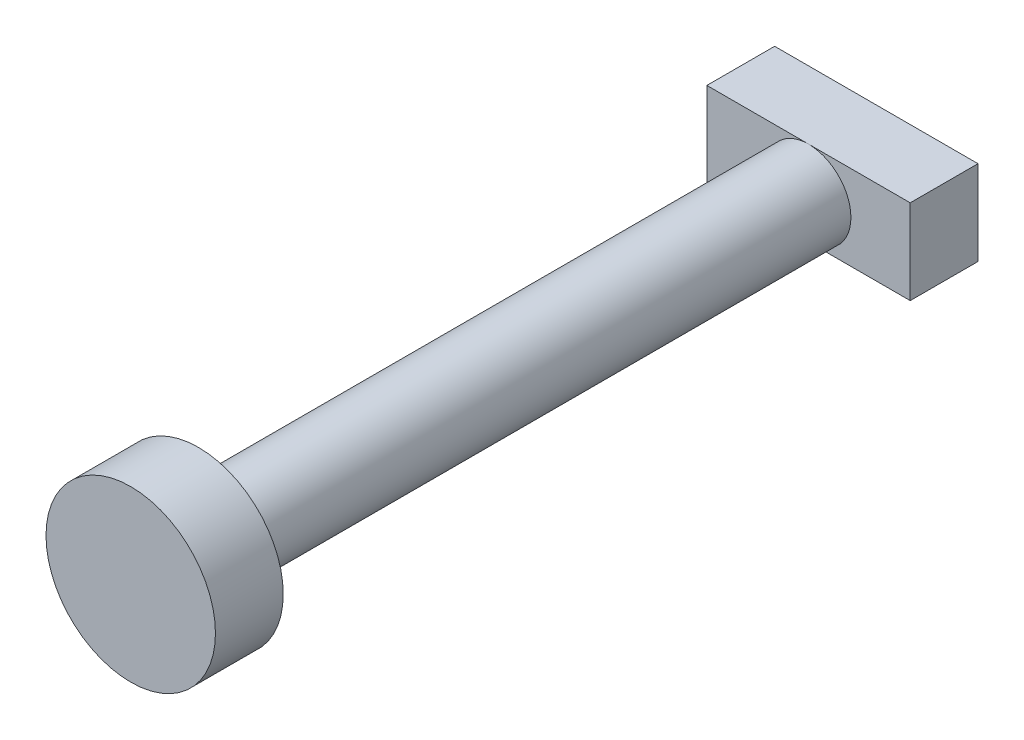
ISO-10303-21;
HEADER;
FILE_DESCRIPTION(('STEP AP214'),'2;1');
FILE_NAME('part.step','',(''),(''),'','','');
FILE_SCHEMA(('AUTOMOTIVE_DESIGN { 1 0 10303 214 1 1 1 1 }'));
ENDSEC;
DATA;
#1=APPLICATION_CONTEXT('core data for automotive mechanical design processes');
#2=APPLICATION_PROTOCOL_DEFINITION('international standard','automotive_design',2000,#1);
#3=PRODUCT_CONTEXT('',#1,'mechanical');
#4=PRODUCT('Part','Part','',(#3));
#5=PRODUCT_RELATED_PRODUCT_CATEGORY('part','',(#4));
#6=PRODUCT_DEFINITION_FORMATION('','',#4);
#7=PRODUCT_DEFINITION_CONTEXT('part definition',#1,'design');
#8=PRODUCT_DEFINITION('design','',#6,#7);
#9=PRODUCT_DEFINITION_SHAPE('','',#8);
#10=(LENGTH_UNIT() NAMED_UNIT(*) SI_UNIT(.MILLI.,.METRE.));
#11=(NAMED_UNIT(*) PLANE_ANGLE_UNIT() SI_UNIT($,.RADIAN.));
#12=(NAMED_UNIT(*) SI_UNIT($,.STERADIAN.) SOLID_ANGLE_UNIT());
#13=UNCERTAINTY_MEASURE_WITH_UNIT(LENGTH_MEASURE(1.E-05),#10,'distance_accuracy_value','');
#14=(GEOMETRIC_REPRESENTATION_CONTEXT(3) GLOBAL_UNCERTAINTY_ASSIGNED_CONTEXT((#13)) GLOBAL_UNIT_ASSIGNED_CONTEXT((#10,
#11,#12)) REPRESENTATION_CONTEXT('',''));
#15=CARTESIAN_POINT('',(0.,0.,0.));
#16=DIRECTION('',(0.,0.,1.));
#17=DIRECTION('',(1.,0.,0.));
#18=AXIS2_PLACEMENT_3D('',#15,#16,#17);
#19=CARTESIAN_POINT('',(0.,0.,9.));
#20=DIRECTION('',(0.,0.,-1.));
#21=DIRECTION('',(-1.,0.,0.));
#22=AXIS2_PLACEMENT_3D('',#19,#20,#21);
#23=CYLINDRICAL_SURFACE('',#22,1.25);
#24=CARTESIAN_POINT('',(0.,0.,9.));
#25=DIRECTION('',(0.,0.,1.));
#26=DIRECTION('',(1.,0.,0.));
#27=AXIS2_PLACEMENT_3D('',#24,#25,#26);
#28=CIRCLE('',#27,1.25);
#29=CARTESIAN_POINT('',(1.25,0.,9.));
#30=VERTEX_POINT('',#29);
#31=EDGE_CURVE('E11',#30,#30,#28,.T.);
#32=ORIENTED_EDGE('',*,*,#31,.F.);
#33=EDGE_LOOP('',(#32));
#34=FACE_BOUND('',#33,.T.);
#35=CARTESIAN_POINT('',(0.,0.,-9.));
#36=DIRECTION('',(0.,0.,1.));
#37=DIRECTION('',(1.,0.,0.));
#38=AXIS2_PLACEMENT_3D('',#35,#36,#37);
#39=CIRCLE('',#38,1.25);
#40=CARTESIAN_POINT('',(0.,1.25,-9.));
#41=VERTEX_POINT('',#40);
#42=CARTESIAN_POINT('',(0.,-1.25,-9.));
#43=VERTEX_POINT('',#42);
#44=EDGE_CURVE('E46',#41,#43,#39,.T.);
#45=ORIENTED_EDGE('',*,*,#44,.T.);
#46=EDGE_CURVE('E65',#43,#41,#39,.T.);
#47=ORIENTED_EDGE('',*,*,#46,.T.);
#48=EDGE_LOOP('',(#45,#47));
#49=FACE_BOUND('',#48,.T.);
#50=ADVANCED_FACE('F43',(#34,#49),#23,.T.);
#51=CARTESIAN_POINT('',(0.,0.,11.));
#52=DIRECTION('',(0.,0.,-1.));
#53=DIRECTION('',(-1.,0.,0.));
#54=AXIS2_PLACEMENT_3D('',#51,#52,#53);
#55=CYLINDRICAL_SURFACE('',#54,2.5);
#56=CARTESIAN_POINT('',(0.,0.,11.));
#57=DIRECTION('',(0.,0.,1.));
#58=DIRECTION('',(1.,0.,0.));
#59=AXIS2_PLACEMENT_3D('',#56,#57,#58);
#60=CIRCLE('',#59,2.5);
#61=CARTESIAN_POINT('',(2.5,0.,11.));
#62=VERTEX_POINT('',#61);
#63=EDGE_CURVE('E122',#62,#62,#60,.T.);
#64=ORIENTED_EDGE('',*,*,#63,.F.);
#65=EDGE_LOOP('',(#64));
#66=FACE_BOUND('',#65,.T.);
#67=CARTESIAN_POINT('',(0.,0.,9.));
#68=DIRECTION('',(0.,0.,1.));
#69=DIRECTION('',(1.,0.,0.));
#70=AXIS2_PLACEMENT_3D('',#67,#68,#69);
#71=CIRCLE('',#70,2.5);
#72=CARTESIAN_POINT('',(2.5,0.,9.));
#73=VERTEX_POINT('',#72);
#74=EDGE_CURVE('E117',#73,#73,#71,.T.);
#75=ORIENTED_EDGE('',*,*,#74,.T.);
#76=EDGE_LOOP('',(#75));
#77=FACE_BOUND('',#76,.T.);
#78=ADVANCED_FACE('F180',(#66,#77),#55,.T.);
#79=CARTESIAN_POINT('',(0.,0.,11.));
#80=DIRECTION('',(0.,0.,1.));
#81=DIRECTION('',(1.,0.,0.));
#82=AXIS2_PLACEMENT_3D('',#79,#80,#81);
#83=PLANE('',#82);
#84=ORIENTED_EDGE('',*,*,#63,.T.);
#85=EDGE_LOOP('',(#84));
#86=FACE_BOUND('',#85,.T.);
#87=ADVANCED_FACE('F187',(#86),#83,.T.);
#88=CARTESIAN_POINT('',(0.,0.,9.));
#89=DIRECTION('',(0.,0.,1.));
#90=DIRECTION('',(1.,0.,0.));
#91=AXIS2_PLACEMENT_3D('',#88,#89,#90);
#92=PLANE('',#91);
#93=ORIENTED_EDGE('',*,*,#31,.T.);
#94=EDGE_LOOP('',(#93));
#95=FACE_BOUND('',#94,.T.);
#96=ORIENTED_EDGE('',*,*,#74,.F.);
#97=EDGE_LOOP('',(#96));
#98=FACE_BOUND('',#97,.T.);
#99=ADVANCED_FACE('F176',(#95,#98),#92,.F.);
#100=CARTESIAN_POINT('',(0.,0.,-9.));
#101=DIRECTION('',(0.,0.,1.));
#102=DIRECTION('',(1.,0.,0.));
#103=AXIS2_PLACEMENT_3D('',#100,#101,#102);
#104=PLANE('',#103);
#105=ORIENTED_EDGE('',*,*,#44,.F.);
#106=DIRECTION('',(1.,0.,0.));
#107=VECTOR('',#106,1.);
#108=CARTESIAN_POINT('',(3.,1.25,-9.));
#109=LINE('',#108,#107);
#110=CARTESIAN_POINT('',(-3.,1.25,-9.));
#111=VERTEX_POINT('',#110);
#112=EDGE_CURVE('E58',#111,#41,#109,.T.);
#113=ORIENTED_EDGE('',*,*,#112,.F.);
#114=DIRECTION('',(0.,1.,0.));
#115=VECTOR('',#114,1.);
#116=CARTESIAN_POINT('',(-3.,-1.25,-9.));
#117=LINE('',#116,#115);
#118=CARTESIAN_POINT('',(-3.,-1.25,-9.));
#119=VERTEX_POINT('',#118);
#120=EDGE_CURVE('E115',#119,#111,#117,.T.);
#121=ORIENTED_EDGE('',*,*,#120,.F.);
#122=DIRECTION('',(-1.,0.,0.));
#123=VECTOR('',#122,1.);
#124=CARTESIAN_POINT('',(3.,-1.25,-9.));
#125=LINE('',#124,#123);
#126=EDGE_CURVE('E139',#43,#119,#125,.T.);
#127=ORIENTED_EDGE('',*,*,#126,.F.);
#128=EDGE_LOOP('',(#105,#113,#121,#127));
#129=FACE_BOUND('',#128,.T.);
#130=ADVANCED_FACE('F138',(#129),#104,.T.);
#131=ORIENTED_EDGE('',*,*,#46,.F.);
#132=CARTESIAN_POINT('',(3.,-1.25,-9.));
#133=VERTEX_POINT('',#132);
#134=EDGE_CURVE('E111',#133,#43,#125,.T.);
#135=ORIENTED_EDGE('',*,*,#134,.F.);
#136=DIRECTION('',(0.,-1.,0.));
#137=VECTOR('',#136,1.);
#138=CARTESIAN_POINT('',(3.,-1.25,-9.));
#139=LINE('',#138,#137);
#140=CARTESIAN_POINT('',(3.,1.25,-9.));
#141=VERTEX_POINT('',#140);
#142=EDGE_CURVE('E143',#141,#133,#139,.T.);
#143=ORIENTED_EDGE('',*,*,#142,.F.);
#144=EDGE_CURVE('E162',#41,#141,#109,.T.);
#145=ORIENTED_EDGE('',*,*,#144,.F.);
#146=EDGE_LOOP('',(#131,#135,#143,#145));
#147=FACE_BOUND('',#146,.T.);
#148=ADVANCED_FACE('F168',(#147),#104,.T.);
#149=CARTESIAN_POINT('',(-3.,-1.25,-11.));
#150=DIRECTION('',(1.,0.,0.));
#151=DIRECTION('',(0.,0.,-1.));
#152=AXIS2_PLACEMENT_3D('',#149,#150,#151);
#153=PLANE('',#152);
#154=ORIENTED_EDGE('',*,*,#120,.T.);
#155=DIRECTION('',(0.,0.,1.));
#156=VECTOR('',#155,1.);
#157=CARTESIAN_POINT('',(-3.,1.25,-11.));
#158=LINE('',#157,#156);
#159=CARTESIAN_POINT('',(-3.,1.25,-11.));
#160=VERTEX_POINT('',#159);
#161=EDGE_CURVE('E93',#160,#111,#158,.T.);
#162=ORIENTED_EDGE('',*,*,#161,.F.);
#163=DIRECTION('',(0.,1.,0.));
#164=VECTOR('',#163,1.);
#165=CARTESIAN_POINT('',(-3.,-1.25,-11.));
#166=LINE('',#165,#164);
#167=CARTESIAN_POINT('',(-3.,-1.25,-11.));
#168=VERTEX_POINT('',#167);
#169=EDGE_CURVE('E101',#168,#160,#166,.T.);
#170=ORIENTED_EDGE('',*,*,#169,.F.);
#171=DIRECTION('',(0.,0.,1.));
#172=VECTOR('',#171,1.);
#173=CARTESIAN_POINT('',(-3.,-1.25,-11.));
#174=LINE('',#173,#172);
#175=EDGE_CURVE('E153',#168,#119,#174,.T.);
#176=ORIENTED_EDGE('',*,*,#175,.T.);
#177=EDGE_LOOP('',(#154,#162,#170,#176));
#178=FACE_BOUND('',#177,.T.);
#179=ADVANCED_FACE('F113',(#178),#153,.F.);
#180=CARTESIAN_POINT('',(3.,1.25,-11.));
#181=DIRECTION('',(0.,-1.,0.));
#182=DIRECTION('',(0.,0.,-1.));
#183=AXIS2_PLACEMENT_3D('',#180,#181,#182);
#184=PLANE('',#183);
#185=ORIENTED_EDGE('',*,*,#112,.T.);
#186=ORIENTED_EDGE('',*,*,#144,.T.);
#187=DIRECTION('',(0.,0.,1.));
#188=VECTOR('',#187,1.);
#189=CARTESIAN_POINT('',(3.,1.25,-11.));
#190=LINE('',#189,#188);
#191=CARTESIAN_POINT('',(3.,1.25,-11.));
#192=VERTEX_POINT('',#191);
#193=EDGE_CURVE('E96',#192,#141,#190,.T.);
#194=ORIENTED_EDGE('',*,*,#193,.F.);
#195=DIRECTION('',(1.,0.,0.));
#196=VECTOR('',#195,1.);
#197=CARTESIAN_POINT('',(3.,1.25,-11.));
#198=LINE('',#197,#196);
#199=EDGE_CURVE('E89',#160,#192,#198,.T.);
#200=ORIENTED_EDGE('',*,*,#199,.F.);
#201=ORIENTED_EDGE('',*,*,#161,.T.);
#202=EDGE_LOOP('',(#185,#186,#194,#200,#201));
#203=FACE_BOUND('',#202,.T.);
#204=ADVANCED_FACE('F91',(#203),#184,.F.);
#205=CARTESIAN_POINT('',(3.,-1.25,-11.));
#206=DIRECTION('',(-1.,0.,0.));
#207=DIRECTION('',(0.,0.,1.));
#208=AXIS2_PLACEMENT_3D('',#205,#206,#207);
#209=PLANE('',#208);
#210=ORIENTED_EDGE('',*,*,#142,.T.);
#211=DIRECTION('',(0.,0.,1.));
#212=VECTOR('',#211,1.);
#213=CARTESIAN_POINT('',(3.,-1.25,-11.));
#214=LINE('',#213,#212);
#215=CARTESIAN_POINT('',(3.,-1.25,-11.));
#216=VERTEX_POINT('',#215);
#217=EDGE_CURVE('E124',#216,#133,#214,.T.);
#218=ORIENTED_EDGE('',*,*,#217,.F.);
#219=DIRECTION('',(0.,-1.,0.));
#220=VECTOR('',#219,1.);
#221=CARTESIAN_POINT('',(3.,-1.25,-11.));
#222=LINE('',#221,#220);
#223=EDGE_CURVE('E100',#192,#216,#222,.T.);
#224=ORIENTED_EDGE('',*,*,#223,.F.);
#225=ORIENTED_EDGE('',*,*,#193,.T.);
#226=EDGE_LOOP('',(#210,#218,#224,#225));
#227=FACE_BOUND('',#226,.T.);
#228=ADVANCED_FACE('F167',(#227),#209,.F.);
#229=CARTESIAN_POINT('',(3.,-1.25,-11.));
#230=DIRECTION('',(0.,1.,0.));
#231=DIRECTION('',(0.,0.,1.));
#232=AXIS2_PLACEMENT_3D('',#229,#230,#231);
#233=PLANE('',#232);
#234=ORIENTED_EDGE('',*,*,#134,.T.);
#235=ORIENTED_EDGE('',*,*,#126,.T.);
#236=ORIENTED_EDGE('',*,*,#175,.F.);
#237=DIRECTION('',(-1.,0.,0.));
#238=VECTOR('',#237,1.);
#239=CARTESIAN_POINT('',(3.,-1.25,-11.));
#240=LINE('',#239,#238);
#241=EDGE_CURVE('E106',#216,#168,#240,.T.);
#242=ORIENTED_EDGE('',*,*,#241,.F.);
#243=ORIENTED_EDGE('',*,*,#217,.T.);
#244=EDGE_LOOP('',(#234,#235,#236,#242,#243));
#245=FACE_BOUND('',#244,.T.);
#246=ADVANCED_FACE('F146',(#245),#233,.F.);
#247=CARTESIAN_POINT('',(0.,0.,-11.));
#248=DIRECTION('',(0.,0.,1.));
#249=DIRECTION('',(1.,0.,0.));
#250=AXIS2_PLACEMENT_3D('',#247,#248,#249);
#251=PLANE('',#250);
#252=ORIENTED_EDGE('',*,*,#169,.T.);
#253=ORIENTED_EDGE('',*,*,#199,.T.);
#254=ORIENTED_EDGE('',*,*,#223,.T.);
#255=ORIENTED_EDGE('',*,*,#241,.T.);
#256=EDGE_LOOP('',(#252,#253,#254,#255));
#257=FACE_BOUND('',#256,.T.);
#258=ADVANCED_FACE('F104',(#257),#251,.F.);
#259=CLOSED_SHELL('',(#50,#78,#87,#99,#130,#148,#179,#204,#228,#246,#258));
#260=MANIFOLD_SOLID_BREP('B2',#259);
#261=ADVANCED_BREP_SHAPE_REPRESENTATION('',(#18,#260),#14);
#262=SHAPE_DEFINITION_REPRESENTATION(#9,#261);
ENDSEC;
END-ISO-10303-21;
